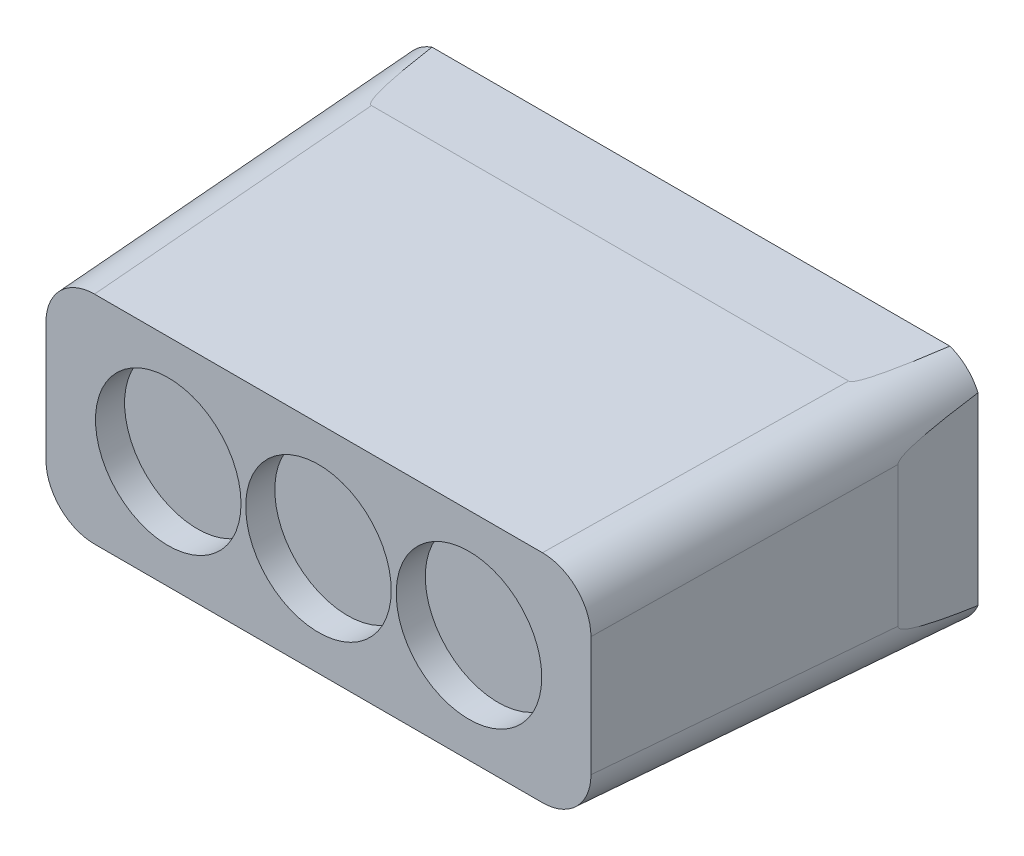
ISO-10303-21;
HEADER;
FILE_DESCRIPTION(('STEP AP214'),'2;1');
FILE_NAME('part.step','',(''),(''),'','','');
FILE_SCHEMA(('AUTOMOTIVE_DESIGN { 1 0 10303 214 1 1 1 1 }'));
ENDSEC;
DATA;
#1=APPLICATION_CONTEXT('core data for automotive mechanical design processes');
#2=APPLICATION_PROTOCOL_DEFINITION('international standard','automotive_design',2000,#1);
#3=PRODUCT_CONTEXT('',#1,'mechanical');
#4=PRODUCT('Part','Part','',(#3));
#5=PRODUCT_RELATED_PRODUCT_CATEGORY('part','',(#4));
#6=PRODUCT_DEFINITION_FORMATION('','',#4);
#7=PRODUCT_DEFINITION_CONTEXT('part definition',#1,'design');
#8=PRODUCT_DEFINITION('design','',#6,#7);
#9=PRODUCT_DEFINITION_SHAPE('','',#8);
#10=(LENGTH_UNIT() NAMED_UNIT(*) SI_UNIT(.MILLI.,.METRE.));
#11=(NAMED_UNIT(*) PLANE_ANGLE_UNIT() SI_UNIT($,.RADIAN.));
#12=(NAMED_UNIT(*) SI_UNIT($,.STERADIAN.) SOLID_ANGLE_UNIT());
#13=UNCERTAINTY_MEASURE_WITH_UNIT(LENGTH_MEASURE(1.E-05),#10,'distance_accuracy_value','');
#14=(GEOMETRIC_REPRESENTATION_CONTEXT(3) GLOBAL_UNCERTAINTY_ASSIGNED_CONTEXT((#13)) GLOBAL_UNIT_ASSIGNED_CONTEXT((#10,
#11,#12)) REPRESENTATION_CONTEXT('',''));
#15=CARTESIAN_POINT('',(0.,0.,0.));
#16=DIRECTION('',(0.,0.,1.));
#17=DIRECTION('',(1.,0.,0.));
#18=AXIS2_PLACEMENT_3D('',#15,#16,#17);
#19=CARTESIAN_POINT('',(-51.2415680348159,68.,3.83829323673599));
#20=DIRECTION('',(0.,0.,1.));
#21=DIRECTION('',(1.,0.,0.));
#22=AXIS2_PLACEMENT_3D('',#19,#20,#21);
#23=PLANE('',#22);
#24=CARTESIAN_POINT('',(-56.3070745697897,41.7241873804971,3.838293236736));
#25=DIRECTION('',(0.,0.,1.));
#26=DIRECTION('',(1.,0.,0.));
#27=AXIS2_PLACEMENT_3D('',#24,#25,#26);
#28=CIRCLE('',#27,0.749999999999994);
#29=CARTESIAN_POINT('',(-55.5570745697897,41.7241873804971,3.838293236736));
#30=VERTEX_POINT('',#29);
#31=EDGE_CURVE('E535',#30,#30,#28,.T.);
#32=ORIENTED_EDGE('',*,*,#31,.F.);
#33=EDGE_LOOP('',(#32));
#34=FACE_BOUND('',#33,.T.);
#35=CARTESIAN_POINT('',(-57.8552971804723,41.7241873804971,3.838293236736));
#36=DIRECTION('',(0.,0.,1.));
#37=DIRECTION('',(1.,0.,0.));
#38=AXIS2_PLACEMENT_3D('',#35,#36,#37);
#39=CIRCLE('',#38,0.749999999999987);
#40=CARTESIAN_POINT('',(-57.1052971804723,41.7241873804971,3.838293236736));
#41=VERTEX_POINT('',#40);
#42=EDGE_CURVE('E537',#41,#41,#39,.T.);
#43=ORIENTED_EDGE('',*,*,#42,.F.);
#44=EDGE_LOOP('',(#43));
#45=FACE_BOUND('',#44,.T.);
#46=CARTESIAN_POINT('',(-54.756140851203,41.7241873804971,3.838293236736));
#47=DIRECTION('',(0.,0.,1.));
#48=DIRECTION('',(1.,0.,0.));
#49=AXIS2_PLACEMENT_3D('',#46,#47,#48);
#50=CIRCLE('',#49,0.749999999999994);
#51=CARTESIAN_POINT('',(-54.006140851203,41.7241873804971,3.838293236736));
#52=VERTEX_POINT('',#51);
#53=EDGE_CURVE('E545',#52,#52,#50,.T.);
#54=ORIENTED_EDGE('',*,*,#53,.F.);
#55=EDGE_LOOP('',(#54));
#56=FACE_BOUND('',#55,.T.);
#57=DIRECTION('',(0.,1.,0.));
#58=VECTOR('',#57,1.);
#59=CARTESIAN_POINT('',(-59.1151599079529,0.,3.83829323673599));
#60=LINE('',#59,#58);
#61=CARTESIAN_POINT('',(-59.1151599079529,41.1079598917547,3.83829323673599));
#62=VERTEX_POINT('',#61);
#63=CARTESIAN_POINT('',(-59.1151599079529,42.3404148692395,3.83829323673599));
#64=VERTEX_POINT('',#63);
#65=EDGE_CURVE('E142',#62,#64,#60,.T.);
#66=ORIENTED_EDGE('',*,*,#65,.F.);
#67=CARTESIAN_POINT('',(-58.6145352980904,41.1088338000512,3.83829323673599));
#68=DIRECTION('',(0.,0.,1.));
#69=DIRECTION('',(0.819231920519038,0.573462344363331,0.));
#70=AXIS2_PLACEMENT_3D('',#67,#68,#69);
#71=ELLIPSE('',#70,0.500930384384896,0.5);
#72=CARTESIAN_POINT('',(-58.6154097626447,40.6085276437829,3.838293236736));
#73=VERTEX_POINT('',#72);
#74=EDGE_CURVE('E278',#62,#73,#71,.T.);
#75=ORIENTED_EDGE('',*,*,#74,.T.);
#76=DIRECTION('',(-1.,0.,0.));
#77=VECTOR('',#76,1.);
#78=CARTESIAN_POINT('',(0.,40.6085276437829,3.838293236736));
#79=LINE('',#78,#77);
#80=CARTESIAN_POINT('',(-53.9987393769346,40.6085276437829,3.838293236736));
#81=VERTEX_POINT('',#80);
#82=EDGE_CURVE('E146',#81,#73,#79,.T.);
#83=ORIENTED_EDGE('',*,*,#82,.F.);
#84=CARTESIAN_POINT('',(-53.999613841489,41.1088338000512,3.838293236736));
#85=DIRECTION('',(0.,0.,1.));
#86=DIRECTION('',(-0.819231920519038,0.573462344363331,0.));
#87=AXIS2_PLACEMENT_3D('',#84,#85,#86);
#88=ELLIPSE('',#87,0.500930384384896,0.5);
#89=CARTESIAN_POINT('',(-53.4989892316265,41.1079598917547,3.83829323673599));
#90=VERTEX_POINT('',#89);
#91=EDGE_CURVE('E276',#81,#90,#88,.T.);
#92=ORIENTED_EDGE('',*,*,#91,.T.);
#93=DIRECTION('',(0.,-1.,0.));
#94=VECTOR('',#93,1.);
#95=CARTESIAN_POINT('',(-53.4989892316265,0.,3.83829323673599));
#96=LINE('',#95,#94);
#97=CARTESIAN_POINT('',(-53.4989892316265,42.3404148692395,3.83829323673599));
#98=VERTEX_POINT('',#97);
#99=EDGE_CURVE('E190',#98,#90,#96,.T.);
#100=ORIENTED_EDGE('',*,*,#99,.F.);
#101=CARTESIAN_POINT('',(-53.999613841489,42.339540960943,3.83829323673599));
#102=DIRECTION('',(0.,0.,1.));
#103=DIRECTION('',(-0.819231920519038,-0.573462344363331,0.));
#104=AXIS2_PLACEMENT_3D('',#101,#102,#103);
#105=ELLIPSE('',#104,0.500930384384896,0.5);
#106=CARTESIAN_POINT('',(-53.9987393769346,42.8398471172114,3.83829323673599));
#107=VERTEX_POINT('',#106);
#108=EDGE_CURVE('E187',#98,#107,#105,.T.);
#109=ORIENTED_EDGE('',*,*,#108,.T.);
#110=DIRECTION('',(1.,0.,0.));
#111=VECTOR('',#110,1.);
#112=CARTESIAN_POINT('',(0.,42.8398471172114,3.83829323673599));
#113=LINE('',#112,#111);
#114=CARTESIAN_POINT('',(-58.6154097626448,42.8398471172114,3.83829323673599));
#115=VERTEX_POINT('',#114);
#116=EDGE_CURVE('E182',#115,#107,#113,.T.);
#117=ORIENTED_EDGE('',*,*,#116,.F.);
#118=CARTESIAN_POINT('',(-58.6145352980904,42.339540960943,3.83829323673599));
#119=DIRECTION('',(0.,0.,1.));
#120=DIRECTION('',(0.819231920519038,-0.573462344363331,0.));
#121=AXIS2_PLACEMENT_3D('',#118,#119,#120);
#122=ELLIPSE('',#121,0.500930384384896,0.5);
#123=EDGE_CURVE('E185',#115,#64,#122,.T.);
#124=ORIENTED_EDGE('',*,*,#123,.T.);
#125=EDGE_LOOP('',(#66,#75,#83,#92,#100,#109,#117,#124));
#126=FACE_BOUND('',#125,.T.);
#127=ADVANCED_FACE('F45',(#34,#45,#56,#126),#23,.T.);
#128=CARTESIAN_POINT('',(0.,42.9216084101946,1.50225629435683));
#129=DIRECTION('',(0.,0.999388062160532,0.0349785821756189));
#130=DIRECTION('',(0.,-0.0349785821756189,0.999388062160532));
#131=AXIS2_PLACEMENT_3D('',#128,#129,#130);
#132=PLANE('',#131);
#133=ORIENTED_EDGE('',*,*,#116,.T.);
#134=DIRECTION('',(-0.0499071343629875,-0.0349349940540916,0.99814268725975));
#135=VECTOR('',#134,1.);
#136=CARTESIAN_POINT('',(-53.7477325993571,43.0155518615156,-1.18184231481479));
#137=LINE('',#136,#135);
#138=CARTESIAN_POINT('',(-53.8484942149002,42.9450187306355,0.833389996047474));
#139=VERTEX_POINT('',#138);
#140=EDGE_CURVE('E60',#107,#139,#137,.F.);
#141=ORIENTED_EDGE('',*,*,#140,.T.);
#142=DIRECTION('',(1.,0.,0.));
#143=VECTOR('',#142,1.);
#144=CARTESIAN_POINT('',(-109.,42.9450187306355,0.833389996047474));
#145=LINE('',#144,#143);
#146=CARTESIAN_POINT('',(-58.7656549246792,42.9450187306355,0.833389996047474));
#147=VERTEX_POINT('',#146);
#148=EDGE_CURVE('E183',#147,#139,#145,.T.);
#149=ORIENTED_EDGE('',*,*,#148,.F.);
#150=DIRECTION('',(0.0499071343629875,-0.0349349940540916,0.99814268725975));
#151=VECTOR('',#150,1.);
#152=CARTESIAN_POINT('',(-58.5859259946556,42.8192084796189,4.42796859651946));
#153=LINE('',#152,#151);
#154=EDGE_CURVE('E176',#147,#115,#153,.T.);
#155=ORIENTED_EDGE('',*,*,#154,.T.);
#156=EDGE_LOOP('',(#133,#141,#149,#155));
#157=FACE_BOUND('',#156,.T.);
#158=ADVANCED_FACE('F181',(#157),#132,.T.);
#159=CARTESIAN_POINT('',(-53.1741392217353,0.,-2.65870696108677));
#160=DIRECTION('',(0.998752338877845,0.,0.0499376169438923));
#161=DIRECTION('',(0.0499376169438923,0.,-0.998752338877845));
#162=AXIS2_PLACEMENT_3D('',#159,#160,#161);
#163=PLANE('',#162);
#164=ORIENTED_EDGE('',*,*,#99,.T.);
#165=DIRECTION('',(-0.0499071343629875,0.0349349940540916,0.99814268725975));
#166=VECTOR('',#165,1.);
#167=CARTESIAN_POINT('',(-53.1028637343773,40.8306720436803,-4.08421670824769));
#168=LINE('',#167,#166);
#169=CARTESIAN_POINT('',(-53.348314992132,41.0024879241085,0.824808446845474));
#170=VERTEX_POINT('',#169);
#171=EDGE_CURVE('E170',#90,#170,#168,.F.);
#172=ORIENTED_EDGE('',*,*,#171,.T.);
#173=DIRECTION('',(0.,-1.,0.));
#174=VECTOR('',#173,1.);
#175=CARTESIAN_POINT('',(-53.348314992132,124.,0.824808446845474));
#176=LINE('',#175,#174);
#177=CARTESIAN_POINT('',(-53.348314992132,42.4458868368857,0.824808446845474));
#178=VERTEX_POINT('',#177);
#179=EDGE_CURVE('E156',#178,#170,#176,.T.);
#180=ORIENTED_EDGE('',*,*,#179,.F.);
#181=DIRECTION('',(-0.0499071343629875,-0.0349349940540916,0.99814268725975));
#182=VECTOR('',#181,1.);
#183=CARTESIAN_POINT('',(-53.2483564299182,42.5158578304354,-1.17436279743066));
#184=LINE('',#183,#182);
#185=EDGE_CURVE('E162',#178,#98,#184,.T.);
#186=ORIENTED_EDGE('',*,*,#185,.T.);
#187=EDGE_LOOP('',(#164,#172,#180,#186));
#188=FACE_BOUND('',#187,.T.);
#189=ADVANCED_FACE('F384',(#188),#163,.T.);
#190=CARTESIAN_POINT('',(-59.1591766282191,0.,2.95795883141096));
#191=DIRECTION('',(-0.998752338877845,0.,0.0499376169438923));
#192=DIRECTION('',(0.0499376169438923,0.,0.998752338877845));
#193=AXIS2_PLACEMENT_3D('',#190,#191,#192);
#194=PLANE('',#193);
#195=DIRECTION('',(0.,-1.,0.));
#196=VECTOR('',#195,1.);
#197=CARTESIAN_POINT('',(-59.2810402971143,0.,0.520685453507318));
#198=LINE('',#197,#196);
#199=CARTESIAN_POINT('',(-59.2810402971143,42.4565311416526,0.520685453507318));
#200=VERTEX_POINT('',#199);
#201=CARTESIAN_POINT('',(-59.2810402971143,40.9918436193417,0.520685453507318));
#202=VERTEX_POINT('',#201);
#203=EDGE_CURVE('E139',#200,#202,#198,.T.);
#204=ORIENTED_EDGE('',*,*,#203,.T.);
#205=DIRECTION('',(0.0499071343629875,0.0349349940540916,0.99814268725975));
#206=VECTOR('',#205,1.);
#207=CARTESIAN_POINT('',(-59.2307948596354,41.027015425577,1.52559420308656));
#208=LINE('',#207,#206);
#209=EDGE_CURVE('E145',#202,#62,#208,.T.);
#210=ORIENTED_EDGE('',*,*,#209,.T.);
#211=ORIENTED_EDGE('',*,*,#65,.T.);
#212=DIRECTION('',(0.0499071343629875,-0.0349349940540916,0.99814268725975));
#213=VECTOR('',#212,1.);
#214=CARTESIAN_POINT('',(-59.0853021640945,42.3195144485387,4.4354481139036));
#215=LINE('',#214,#213);
#216=EDGE_CURVE('E135',#64,#200,#215,.F.);
#217=ORIENTED_EDGE('',*,*,#216,.T.);
#218=EDGE_LOOP('',(#204,#210,#211,#217));
#219=FACE_BOUND('',#218,.T.);
#220=ADVANCED_FACE('F137',(#219),#194,.T.);
#221=CARTESIAN_POINT('',(0.,40.4246671632222,-1.41486335071279));
#222=DIRECTION('',(0.,-0.999388062160532,0.0349785821756189));
#223=DIRECTION('',(0.,-0.0349785821756189,-0.999388062160532));
#224=AXIS2_PLACEMENT_3D('',#221,#222,#223);
#225=PLANE('',#224);
#226=ORIENTED_EDGE('',*,*,#82,.T.);
#227=DIRECTION('',(0.0499071343629875,0.0349349940540916,0.99814268725975));
#228=VECTOR('',#227,1.);
#229=CARTESIAN_POINT('',(-58.7314186901964,40.5273213944967,1.51811468570243));
#230=LINE('',#229,#228);
#231=CARTESIAN_POINT('',(-58.7646046323068,40.5040912350195,0.854395843495706));
#232=VERTEX_POINT('',#231);
#233=EDGE_CURVE('E283',#73,#232,#230,.F.);
#234=ORIENTED_EDGE('',*,*,#233,.T.);
#235=DIRECTION('',(1.,0.,0.));
#236=VECTOR('',#235,1.);
#237=CARTESIAN_POINT('',(-109.,40.5040912350195,0.854395843495706));
#238=LINE('',#237,#236);
#239=CARTESIAN_POINT('',(-53.8495445072726,40.5040912350195,0.854395843495706));
#240=VERTEX_POINT('',#239);
#241=EDGE_CURVE('E189',#232,#240,#238,.T.);
#242=ORIENTED_EDGE('',*,*,#241,.T.);
#243=DIRECTION('',(-0.0499071343629875,0.0349349940540916,0.99814268725975));
#244=VECTOR('',#243,1.);
#245=CARTESIAN_POINT('',(-53.6022399038162,40.3309780126,-4.09169622563183));
#246=LINE('',#245,#244);
#247=EDGE_CURVE('E280',#240,#81,#246,.T.);
#248=ORIENTED_EDGE('',*,*,#247,.T.);
#249=EDGE_LOOP('',(#226,#234,#242,#248));
#250=FACE_BOUND('',#249,.T.);
#251=ADVANCED_FACE('F316',(#250),#225,.T.);
#252=CARTESIAN_POINT('',(-53.348314992132,124.,-0.307009282522216));
#253=DIRECTION('',(1.,0.,0.));
#254=DIRECTION('',(0.,0.,-1.));
#255=AXIS2_PLACEMENT_3D('',#252,#253,#254);
#256=PLANE('',#255);
#257=ORIENTED_EDGE('',*,*,#179,.T.);
#258=CARTESIAN_POINT('',(-53.348314992132,40.6529246055013,-9.18768375040508));
#259=DIRECTION('',(1.,0.,0.));
#260=DIRECTION('',(0.,0.0349785821756189,0.999388062160532));
#261=AXIS2_PLACEMENT_3D('',#258,#259,#260);
#262=ELLIPSE('',#261,10.0186076876979,0.5);
#263=CARTESIAN_POINT('',(-53.348314992132,40.7748431976759,0.));
#264=VERTEX_POINT('',#263);
#265=EDGE_CURVE('E174',#170,#264,#262,.T.);
#266=ORIENTED_EDGE('',*,*,#265,.T.);
#267=DIRECTION('',(0.,-1.,0.));
#268=VECTOR('',#267,1.);
#269=CARTESIAN_POINT('',(-53.348314992132,40.5040912350195,0.));
#270=LINE('',#269,#268);
#271=CARTESIAN_POINT('',(-53.348314992132,42.6735315633183,0.));
#272=VERTEX_POINT('',#271);
#273=EDGE_CURVE('E300',#272,#264,#270,.T.);
#274=ORIENTED_EDGE('',*,*,#273,.F.);
#275=CARTESIAN_POINT('',(-53.348314992132,42.795450155493,-9.18768375040507));
#276=DIRECTION('',(1.,0.,0.));
#277=DIRECTION('',(0.,-0.0349785821756189,0.999388062160532));
#278=AXIS2_PLACEMENT_3D('',#275,#276,#277);
#279=ELLIPSE('',#278,10.0186076876979,0.5);
#280=EDGE_CURVE('E172',#272,#178,#279,.T.);
#281=ORIENTED_EDGE('',*,*,#280,.T.);
#282=EDGE_LOOP('',(#257,#266,#274,#281));
#283=FACE_BOUND('',#282,.T.);
#284=ADVANCED_FACE('F349',(#283),#256,.T.);
#285=CARTESIAN_POINT('',(-109.,42.9450187306355,-0.369809481750954));
#286=DIRECTION('',(0.,1.,0.));
#287=DIRECTION('',(0.,0.,1.));
#288=AXIS2_PLACEMENT_3D('',#285,#286,#287);
#289=PLANE('',#288);
#290=ORIENTED_EDGE('',*,*,#148,.T.);
#291=CARTESIAN_POINT('',(-53.1346455990712,42.9450187306355,-13.4610716116192));
#292=DIRECTION('',(0.,1.,0.));
#293=DIRECTION('',(-0.0499376169438923,0.,0.998752338877845));
#294=AXIS2_PLACEMENT_3D('',#291,#292,#293);
#295=ELLIPSE('',#294,14.3122966967112,0.5);
#296=CARTESIAN_POINT('',(-53.638436696045,42.9450187306355,0.));
#297=VERTEX_POINT('',#296);
#298=EDGE_CURVE('E12',#139,#297,#295,.T.);
#299=ORIENTED_EDGE('',*,*,#298,.T.);
#300=DIRECTION('',(1.,0.,0.));
#301=VECTOR('',#300,1.);
#302=CARTESIAN_POINT('',(-53.348314992132,42.9450187306355,0.));
#303=LINE('',#302,#301);
#304=CARTESIAN_POINT('',(-58.9757124435344,42.9450187306355,0.));
#305=VERTEX_POINT('',#304);
#306=EDGE_CURVE('E320',#305,#297,#303,.T.);
#307=ORIENTED_EDGE('',*,*,#306,.F.);
#308=CARTESIAN_POINT('',(-59.4795035405081,42.9450187306355,-13.4610716116193));
#309=DIRECTION('',(0.,1.,0.));
#310=DIRECTION('',(0.0499376169438923,0.,0.998752338877845));
#311=AXIS2_PLACEMENT_3D('',#308,#309,#310);
#312=ELLIPSE('',#311,14.3122966967112,0.5);
#313=EDGE_CURVE('E53',#305,#147,#312,.T.);
#314=ORIENTED_EDGE('',*,*,#313,.T.);
#315=EDGE_LOOP('',(#290,#299,#307,#314));
#316=FACE_BOUND('',#315,.T.);
#317=ADVANCED_FACE('F335',(#316),#289,.T.);
#318=CARTESIAN_POINT('',(-109.,40.5040912350195,-0.286109695177261));
#319=DIRECTION('',(0.,1.,0.));
#320=DIRECTION('',(0.,0.,1.));
#321=AXIS2_PLACEMENT_3D('',#318,#319,#320);
#322=PLANE('',#321);
#323=ORIENTED_EDGE('',*,*,#241,.F.);
#324=CARTESIAN_POINT('',(-59.4784532481357,40.5040912350195,-13.4400657641714));
#325=DIRECTION('',(0.,1.,0.));
#326=DIRECTION('',(0.0499376169438923,0.,0.998752338877845));
#327=AXIS2_PLACEMENT_3D('',#324,#325,#326);
#328=ELLIPSE('',#327,14.3122966967112,0.5);
#329=CARTESIAN_POINT('',(-58.9777561769909,40.5040912350195,0.));
#330=VERTEX_POINT('',#329);
#331=EDGE_CURVE('E287',#232,#330,#328,.F.);
#332=ORIENTED_EDGE('',*,*,#331,.T.);
#333=DIRECTION('',(-1.,0.,0.));
#334=VECTOR('',#333,1.);
#335=CARTESIAN_POINT('',(-59.2810402971143,40.5040912350195,0.));
#336=LINE('',#335,#334);
#337=CARTESIAN_POINT('',(-53.6363929625885,40.5040912350195,0.));
#338=VERTEX_POINT('',#337);
#339=EDGE_CURVE('E297',#338,#330,#336,.T.);
#340=ORIENTED_EDGE('',*,*,#339,.F.);
#341=CARTESIAN_POINT('',(-53.1356958914437,40.5040912350195,-13.4400657641711));
#342=DIRECTION('',(0.,1.,0.));
#343=DIRECTION('',(-0.0499376169438923,0.,0.998752338877845));
#344=AXIS2_PLACEMENT_3D('',#341,#342,#343);
#345=ELLIPSE('',#344,14.3122966967112,0.5);
#346=EDGE_CURVE('E285',#338,#240,#345,.F.);
#347=ORIENTED_EDGE('',*,*,#346,.T.);
#348=EDGE_LOOP('',(#323,#332,#340,#347));
#349=FACE_BOUND('',#348,.T.);
#350=ADVANCED_FACE('F306',(#349),#322,.F.);
#351=CARTESIAN_POINT('',(-59.2810402971143,42.9450187306355,0.));
#352=DIRECTION('',(1.,0.,0.));
#353=DIRECTION('',(0.,0.,-1.));
#354=AXIS2_PLACEMENT_3D('',#351,#352,#353);
#355=PLANE('',#354);
#356=DIRECTION('',(0.,1.,0.));
#357=VECTOR('',#356,1.);
#358=CARTESIAN_POINT('',(-59.2810402971143,42.9450187306355,0.));
#359=LINE('',#358,#357);
#360=CARTESIAN_POINT('',(-59.2810402971143,40.814427377605,0.));
#361=VERTEX_POINT('',#360);
#362=CARTESIAN_POINT('',(-59.2810402971143,42.6339473833893,0.));
#363=VERTEX_POINT('',#362);
#364=EDGE_CURVE('E308',#361,#363,#359,.T.);
#365=ORIENTED_EDGE('',*,*,#364,.F.);
#366=CARTESIAN_POINT('',(-59.2810402971143,40.6422803007345,-9.49180674374306));
#367=DIRECTION('',(1.,0.,0.));
#368=DIRECTION('',(0.,0.0349785821756189,0.999388062160532));
#369=AXIS2_PLACEMENT_3D('',#366,#367,#368);
#370=ELLIPSE('',#369,10.0186076876979,0.5);
#371=EDGE_CURVE('E154',#361,#202,#370,.F.);
#372=ORIENTED_EDGE('',*,*,#371,.T.);
#373=ORIENTED_EDGE('',*,*,#203,.F.);
#374=CARTESIAN_POINT('',(-59.2810402971143,42.8060944602598,-9.49180674374291));
#375=DIRECTION('',(1.,0.,0.));
#376=DIRECTION('',(0.,-0.0349785821756189,0.999388062160532));
#377=AXIS2_PLACEMENT_3D('',#374,#375,#376);
#378=ELLIPSE('',#377,10.0186076876979,0.5);
#379=EDGE_CURVE('E151',#200,#363,#378,.F.);
#380=ORIENTED_EDGE('',*,*,#379,.T.);
#381=EDGE_LOOP('',(#365,#372,#373,#380));
#382=FACE_BOUND('',#381,.T.);
#383=ADVANCED_FACE('F150',(#382),#355,.F.);
#384=CARTESIAN_POINT('',(0.,0.,0.));
#385=DIRECTION('',(0.,0.,1.));
#386=DIRECTION('',(1.,0.,0.));
#387=AXIS2_PLACEMENT_3D('',#384,#385,#386);
#388=PLANE('',#387);
#389=ORIENTED_EDGE('',*,*,#339,.T.);
#390=CARTESIAN_POINT('',(-58.8064499599272,40.9744935367655,0.));
#391=DIRECTION('',(0.,0.,1.));
#392=DIRECTION('',(0.819231920519038,0.573462344363331,0.));
#393=AXIS2_PLACEMENT_3D('',#390,#391,#392);
#394=ELLIPSE('',#393,0.500930384384896,0.5);
#395=EDGE_CURVE('E160',#330,#361,#394,.F.);
#396=ORIENTED_EDGE('',*,*,#395,.T.);
#397=ORIENTED_EDGE('',*,*,#364,.T.);
#398=CARTESIAN_POINT('',(-58.8064499599272,42.4738812242288,0.));
#399=DIRECTION('',(0.,0.,1.));
#400=DIRECTION('',(0.819231920519038,-0.573462344363331,0.));
#401=AXIS2_PLACEMENT_3D('',#398,#399,#400);
#402=ELLIPSE('',#401,0.500930384384896,0.5);
#403=EDGE_CURVE('E159',#363,#305,#402,.F.);
#404=ORIENTED_EDGE('',*,*,#403,.T.);
#405=ORIENTED_EDGE('',*,*,#306,.T.);
#406=CARTESIAN_POINT('',(-53.8076991796522,42.4738812242288,0.));
#407=DIRECTION('',(0.,0.,1.));
#408=DIRECTION('',(-0.819231920519038,-0.573462344363331,0.));
#409=AXIS2_PLACEMENT_3D('',#406,#407,#408);
#410=ELLIPSE('',#409,0.500930384384896,0.5);
#411=EDGE_CURVE('E290',#297,#272,#410,.F.);
#412=ORIENTED_EDGE('',*,*,#411,.T.);
#413=ORIENTED_EDGE('',*,*,#273,.T.);
#414=CARTESIAN_POINT('',(-53.8076991796522,40.9744935367655,0.));
#415=DIRECTION('',(0.,0.,1.));
#416=DIRECTION('',(-0.819231920519038,0.573462344363331,0.));
#417=AXIS2_PLACEMENT_3D('',#414,#415,#416);
#418=ELLIPSE('',#417,0.500930384384896,0.5);
#419=EDGE_CURVE('E164',#264,#338,#418,.F.);
#420=ORIENTED_EDGE('',*,*,#419,.T.);
#421=EDGE_LOOP('',(#389,#396,#397,#404,#405,#412,#413,#420));
#422=FACE_BOUND('',#421,.T.);
#423=ADVANCED_FACE('F296',(#422),#388,.F.);
#424=CARTESIAN_POINT('',(-54.756140851203,41.7241873804971,3.538293236736));
#425=DIRECTION('',(0.,0.,-1.));
#426=DIRECTION('',(-1.,0.,0.));
#427=AXIS2_PLACEMENT_3D('',#424,#425,#426);
#428=PLANE('',#427);
#429=CARTESIAN_POINT('',(-54.756140851203,41.7241873804971,3.538293236736));
#430=DIRECTION('',(0.,0.,1.));
#431=DIRECTION('',(1.,0.,0.));
#432=AXIS2_PLACEMENT_3D('',#429,#430,#431);
#433=CIRCLE('',#432,0.749999999999994);
#434=CARTESIAN_POINT('',(-54.006140851203,41.7241873804971,3.538293236736));
#435=VERTEX_POINT('',#434);
#436=EDGE_CURVE('E309',#435,#435,#433,.T.);
#437=ORIENTED_EDGE('',*,*,#436,.T.);
#438=EDGE_LOOP('',(#437));
#439=FACE_BOUND('',#438,.T.);
#440=ADVANCED_FACE('F469',(#439),#428,.F.);
#441=CARTESIAN_POINT('',(-54.756140851203,41.7241873804971,3.83829323673599));
#442=DIRECTION('',(0.,0.,1.));
#443=DIRECTION('',(1.,0.,0.));
#444=AXIS2_PLACEMENT_3D('',#441,#442,#443);
#445=CYLINDRICAL_SURFACE('',#444,0.749999999999994);
#446=ORIENTED_EDGE('',*,*,#436,.F.);
#447=EDGE_LOOP('',(#446));
#448=FACE_BOUND('',#447,.T.);
#449=ORIENTED_EDGE('',*,*,#53,.T.);
#450=EDGE_LOOP('',(#449));
#451=FACE_BOUND('',#450,.T.);
#452=ADVANCED_FACE('F510',(#448,#451),#445,.F.);
#453=CARTESIAN_POINT('',(-57.8552971804723,41.7241873804971,3.538293236736));
#454=DIRECTION('',(0.,0.,-1.));
#455=DIRECTION('',(-1.,0.,0.));
#456=AXIS2_PLACEMENT_3D('',#453,#454,#455);
#457=PLANE('',#456);
#458=CARTESIAN_POINT('',(-57.8552971804723,41.7241873804971,3.538293236736));
#459=DIRECTION('',(0.,0.,1.));
#460=DIRECTION('',(1.,0.,0.));
#461=AXIS2_PLACEMENT_3D('',#458,#459,#460);
#462=CIRCLE('',#461,0.749999999999987);
#463=CARTESIAN_POINT('',(-57.1052971804723,41.7241873804971,3.538293236736));
#464=VERTEX_POINT('',#463);
#465=EDGE_CURVE('E542',#464,#464,#462,.T.);
#466=ORIENTED_EDGE('',*,*,#465,.T.);
#467=EDGE_LOOP('',(#466));
#468=FACE_BOUND('',#467,.T.);
#469=ADVANCED_FACE('F514',(#468),#457,.F.);
#470=CARTESIAN_POINT('',(-57.8552971804723,41.7241873804971,3.83829323673599));
#471=DIRECTION('',(0.,0.,1.));
#472=DIRECTION('',(1.,0.,0.));
#473=AXIS2_PLACEMENT_3D('',#470,#471,#472);
#474=CYLINDRICAL_SURFACE('',#473,0.749999999999987);
#475=ORIENTED_EDGE('',*,*,#465,.F.);
#476=EDGE_LOOP('',(#475));
#477=FACE_BOUND('',#476,.T.);
#478=ORIENTED_EDGE('',*,*,#42,.T.);
#479=EDGE_LOOP('',(#478));
#480=FACE_BOUND('',#479,.T.);
#481=ADVANCED_FACE('F518',(#477,#480),#474,.F.);
#482=CARTESIAN_POINT('',(-56.3070745697897,41.7241873804971,3.538293236736));
#483=DIRECTION('',(0.,0.,-1.));
#484=DIRECTION('',(-1.,0.,0.));
#485=AXIS2_PLACEMENT_3D('',#482,#483,#484);
#486=PLANE('',#485);
#487=CARTESIAN_POINT('',(-56.3070745697897,41.7241873804971,3.538293236736));
#488=DIRECTION('',(0.,0.,1.));
#489=DIRECTION('',(1.,0.,0.));
#490=AXIS2_PLACEMENT_3D('',#487,#488,#489);
#491=CIRCLE('',#490,0.749999999999994);
#492=CARTESIAN_POINT('',(-55.5570745697897,41.7241873804971,3.538293236736));
#493=VERTEX_POINT('',#492);
#494=EDGE_CURVE('E532',#493,#493,#491,.T.);
#495=ORIENTED_EDGE('',*,*,#494,.T.);
#496=EDGE_LOOP('',(#495));
#497=FACE_BOUND('',#496,.T.);
#498=ADVANCED_FACE('F522',(#497),#486,.F.);
#499=CARTESIAN_POINT('',(-56.3070745697897,41.7241873804971,3.83829323673599));
#500=DIRECTION('',(0.,0.,1.));
#501=DIRECTION('',(1.,0.,0.));
#502=AXIS2_PLACEMENT_3D('',#499,#500,#501);
#503=CYLINDRICAL_SURFACE('',#502,0.749999999999994);
#504=ORIENTED_EDGE('',*,*,#494,.F.);
#505=EDGE_LOOP('',(#504));
#506=FACE_BOUND('',#505,.T.);
#507=ORIENTED_EDGE('',*,*,#31,.T.);
#508=EDGE_LOOP('',(#507));
#509=FACE_BOUND('',#508,.T.);
#510=ADVANCED_FACE('F428',(#506,#509),#503,.F.);
#511=CARTESIAN_POINT('',(-58.7314186901964,41.027015425577,1.50062539461462));
#512=DIRECTION('',(0.0499071343629875,0.0349349940540916,0.99814268725975));
#513=DIRECTION('',(0.998752338877845,0.,-0.0499376169438923));
#514=AXIS2_PLACEMENT_3D('',#511,#512,#513);
#515=CYLINDRICAL_SURFACE('',#514,0.5);
#516=ORIENTED_EDGE('',*,*,#331,.F.);
#517=ORIENTED_EDGE('',*,*,#233,.F.);
#518=ORIENTED_EDGE('',*,*,#74,.F.);
#519=ORIENTED_EDGE('',*,*,#209,.F.);
#520=ORIENTED_EDGE('',*,*,#371,.F.);
#521=ORIENTED_EDGE('',*,*,#395,.F.);
#522=EDGE_LOOP('',(#516,#517,#518,#519,#520,#521));
#523=FACE_BOUND('',#522,.T.);
#524=ADVANCED_FACE('F319',(#523),#515,.T.);
#525=CARTESIAN_POINT('',(-53.6022399038162,40.8306720436803,-4.10918551671964));
#526=DIRECTION('',(-0.0499071343629875,0.0349349940540916,0.99814268725975));
#527=DIRECTION('',(0.998752338877845,0.,0.0499376169438923));
#528=AXIS2_PLACEMENT_3D('',#525,#526,#527);
#529=CYLINDRICAL_SURFACE('',#528,0.5);
#530=ORIENTED_EDGE('',*,*,#265,.F.);
#531=ORIENTED_EDGE('',*,*,#171,.F.);
#532=ORIENTED_EDGE('',*,*,#91,.F.);
#533=ORIENTED_EDGE('',*,*,#247,.F.);
#534=ORIENTED_EDGE('',*,*,#346,.F.);
#535=ORIENTED_EDGE('',*,*,#419,.F.);
#536=EDGE_LOOP('',(#530,#531,#532,#533,#534,#535));
#537=FACE_BOUND('',#536,.T.);
#538=ADVANCED_FACE('F312',(#537),#529,.T.);
#539=CARTESIAN_POINT('',(-53.7477325993571,42.5158578304354,-1.1993316059026));
#540=DIRECTION('',(-0.0499071343629875,-0.0349349940540916,0.99814268725975));
#541=DIRECTION('',(0.998752338877845,0.,0.0499376169438923));
#542=AXIS2_PLACEMENT_3D('',#539,#540,#541);
#543=CYLINDRICAL_SURFACE('',#542,0.5);
#544=ORIENTED_EDGE('',*,*,#298,.F.);
#545=ORIENTED_EDGE('',*,*,#140,.F.);
#546=ORIENTED_EDGE('',*,*,#108,.F.);
#547=ORIENTED_EDGE('',*,*,#185,.F.);
#548=ORIENTED_EDGE('',*,*,#280,.F.);
#549=ORIENTED_EDGE('',*,*,#411,.F.);
#550=EDGE_LOOP('',(#544,#545,#546,#547,#548,#549));
#551=FACE_BOUND('',#550,.T.);
#552=ADVANCED_FACE('F488',(#551),#543,.T.);
#553=CARTESIAN_POINT('',(-58.5859259946556,42.3195144485387,4.41047930543165));
#554=DIRECTION('',(0.0499071343629875,-0.0349349940540916,0.99814268725975));
#555=DIRECTION('',(0.998752338877845,0.,-0.0499376169438923));
#556=AXIS2_PLACEMENT_3D('',#553,#554,#555);
#557=CYLINDRICAL_SURFACE('',#556,0.5);
#558=ORIENTED_EDGE('',*,*,#379,.F.);
#559=ORIENTED_EDGE('',*,*,#216,.F.);
#560=ORIENTED_EDGE('',*,*,#123,.F.);
#561=ORIENTED_EDGE('',*,*,#154,.F.);
#562=ORIENTED_EDGE('',*,*,#313,.F.);
#563=ORIENTED_EDGE('',*,*,#403,.F.);
#564=EDGE_LOOP('',(#558,#559,#560,#561,#562,#563));
#565=FACE_BOUND('',#564,.T.);
#566=ADVANCED_FACE('F47',(#565),#557,.T.);
#567=CLOSED_SHELL('',(#127,#158,#189,#220,#251,#284,#317,#350,#383,#423,#440,#452,#469,#481,
#498,#510,#524,#538,#552,#566));
#568=MANIFOLD_SOLID_BREP('B2',#567);
#569=ADVANCED_BREP_SHAPE_REPRESENTATION('',(#18,#568),#14);
#570=SHAPE_DEFINITION_REPRESENTATION(#9,#569);
ENDSEC;
END-ISO-10303-21;
